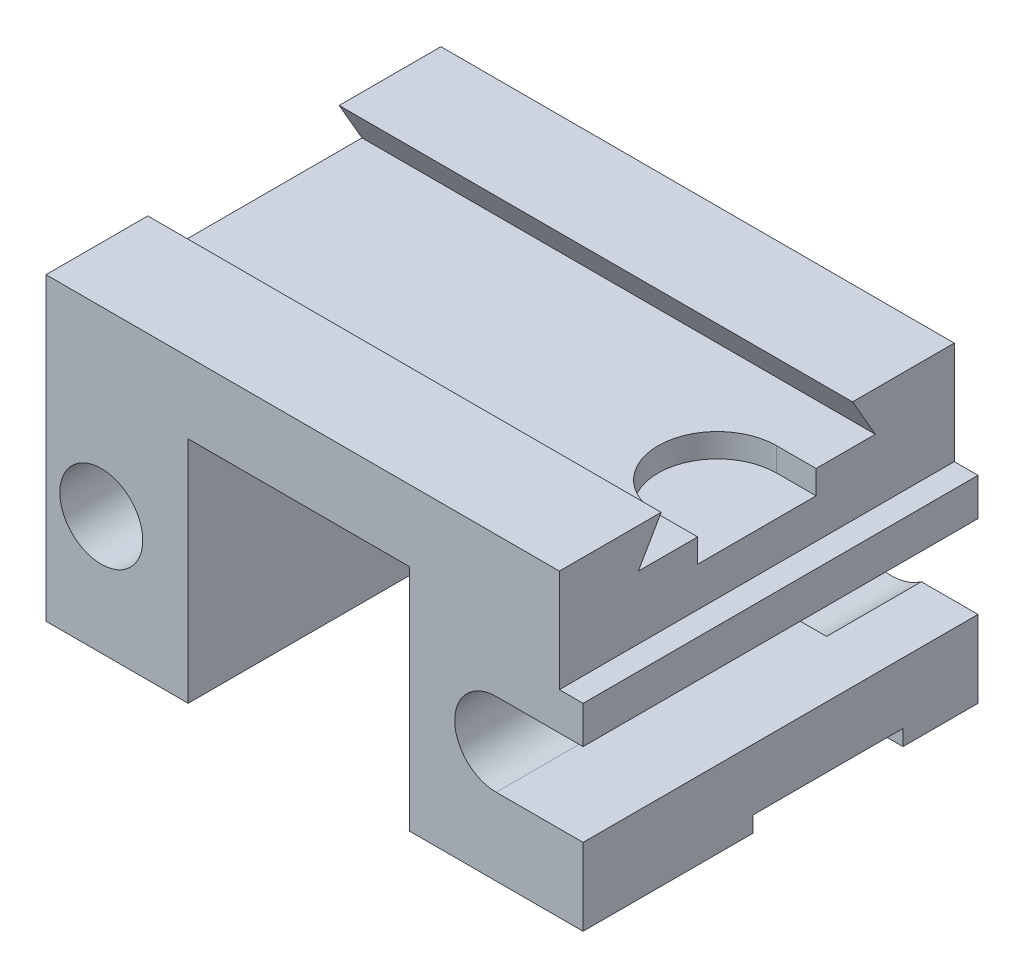
ISO-10303-21;
HEADER;
FILE_DESCRIPTION(('STEP AP214'),'2;1');
FILE_NAME('part.step','',(''),(''),'','','');
FILE_SCHEMA(('AUTOMOTIVE_DESIGN { 1 0 10303 214 1 1 1 1 }'));
ENDSEC;
DATA;
#1=APPLICATION_CONTEXT('core data for automotive mechanical design processes');
#2=APPLICATION_PROTOCOL_DEFINITION('international standard','automotive_design',2000,#1);
#3=PRODUCT_CONTEXT('',#1,'mechanical');
#4=PRODUCT('Part','Part','',(#3));
#5=PRODUCT_RELATED_PRODUCT_CATEGORY('part','',(#4));
#6=PRODUCT_DEFINITION_FORMATION('','',#4);
#7=PRODUCT_DEFINITION_CONTEXT('part definition',#1,'design');
#8=PRODUCT_DEFINITION('design','',#6,#7);
#9=PRODUCT_DEFINITION_SHAPE('','',#8);
#10=(LENGTH_UNIT() NAMED_UNIT(*) SI_UNIT(.MILLI.,.METRE.));
#11=(NAMED_UNIT(*) PLANE_ANGLE_UNIT() SI_UNIT($,.RADIAN.));
#12=(NAMED_UNIT(*) SI_UNIT($,.STERADIAN.) SOLID_ANGLE_UNIT());
#13=UNCERTAINTY_MEASURE_WITH_UNIT(LENGTH_MEASURE(1.E-05),#10,'distance_accuracy_value','');
#14=(GEOMETRIC_REPRESENTATION_CONTEXT(3) GLOBAL_UNCERTAINTY_ASSIGNED_CONTEXT((#13)) GLOBAL_UNIT_ASSIGNED_CONTEXT((#10,
#11,#12)) REPRESENTATION_CONTEXT('',''));
#15=CARTESIAN_POINT('',(0.,0.,0.));
#16=DIRECTION('',(0.,0.,1.));
#17=DIRECTION('',(1.,0.,0.));
#18=AXIS2_PLACEMENT_3D('',#15,#16,#17);
#19=CARTESIAN_POINT('',(0.,3.5,0.));
#20=DIRECTION('',(0.,-1.,0.));
#21=DIRECTION('',(0.,0.,-1.));
#22=AXIS2_PLACEMENT_3D('',#19,#20,#21);
#23=PLANE('',#22);
#24=DIRECTION('',(0.,0.,1.));
#25=VECTOR('',#24,1.);
#26=CARTESIAN_POINT('',(6.5,3.5,0.));
#27=LINE('',#26,#25);
#28=CARTESIAN_POINT('',(6.5,3.5,1.));
#29=VERTEX_POINT('',#28);
#30=CARTESIAN_POINT('',(6.5,3.5,1.75));
#31=VERTEX_POINT('',#30);
#32=EDGE_CURVE('E258',#29,#31,#27,.T.);
#33=ORIENTED_EDGE('',*,*,#32,.F.);
#34=DIRECTION('',(1.,0.,0.));
#35=VECTOR('',#34,1.);
#36=CARTESIAN_POINT('',(0.,3.5,1.));
#37=LINE('',#36,#35);
#38=CARTESIAN_POINT('',(0.,3.5,1.));
#39=VERTEX_POINT('',#38);
#40=EDGE_CURVE('E292',#39,#29,#37,.T.);
#41=ORIENTED_EDGE('',*,*,#40,.F.);
#42=DIRECTION('',(0.,0.,-1.));
#43=VECTOR('',#42,1.);
#44=CARTESIAN_POINT('',(0.,3.5,0.));
#45=LINE('',#44,#43);
#46=CARTESIAN_POINT('',(0.,3.5,4.));
#47=VERTEX_POINT('',#46);
#48=EDGE_CURVE('E282',#47,#39,#45,.T.);
#49=ORIENTED_EDGE('',*,*,#48,.F.);
#50=DIRECTION('',(1.,0.,0.));
#51=VECTOR('',#50,1.);
#52=CARTESIAN_POINT('',(0.,3.5,4.));
#53=LINE('',#52,#51);
#54=CARTESIAN_POINT('',(6.5,3.5,4.));
#55=VERTEX_POINT('',#54);
#56=EDGE_CURVE('E293',#47,#55,#53,.T.);
#57=ORIENTED_EDGE('',*,*,#56,.T.);
#58=CARTESIAN_POINT('',(6.5,3.5,3.25));
#59=VERTEX_POINT('',#58);
#60=EDGE_CURVE('E256',#59,#55,#27,.T.);
#61=ORIENTED_EDGE('',*,*,#60,.F.);
#62=DIRECTION('',(1.,0.,0.));
#63=VECTOR('',#62,1.);
#64=CARTESIAN_POINT('',(0.,3.5,3.25));
#65=LINE('',#64,#63);
#66=CARTESIAN_POINT('',(6.,3.5,3.25));
#67=VERTEX_POINT('',#66);
#68=EDGE_CURVE('E275',#67,#59,#65,.T.);
#69=ORIENTED_EDGE('',*,*,#68,.F.);
#70=CARTESIAN_POINT('',(6.,3.5,2.5));
#71=DIRECTION('',(0.,1.,0.));
#72=DIRECTION('',(0.,0.,1.));
#73=AXIS2_PLACEMENT_3D('',#70,#71,#72);
#74=CIRCLE('',#73,0.75);
#75=CARTESIAN_POINT('',(6.,3.5,1.75));
#76=VERTEX_POINT('',#75);
#77=EDGE_CURVE('E59',#76,#67,#74,.T.);
#78=ORIENTED_EDGE('',*,*,#77,.F.);
#79=DIRECTION('',(1.,0.,0.));
#80=VECTOR('',#79,1.);
#81=CARTESIAN_POINT('',(0.,3.5,1.75));
#82=LINE('',#81,#80);
#83=EDGE_CURVE('E267',#76,#31,#82,.T.);
#84=ORIENTED_EDGE('',*,*,#83,.T.);
#85=EDGE_LOOP('',(#33,#41,#49,#57,#61,#69,#78,#84));
#86=FACE_BOUND('',#85,.T.);
#87=ADVANCED_FACE('F37',(#86),#23,.F.);
#88=CARTESIAN_POINT('',(0.,4.,0.));
#89=DIRECTION('',(0.,1.,0.));
#90=DIRECTION('',(0.,0.,1.));
#91=AXIS2_PLACEMENT_3D('',#88,#89,#90);
#92=PLANE('',#91);
#93=DIRECTION('',(1.,0.,0.));
#94=VECTOR('',#93,1.);
#95=CARTESIAN_POINT('',(0.,4.,5.));
#96=LINE('',#95,#94);
#97=CARTESIAN_POINT('',(0.,4.,5.));
#98=VERTEX_POINT('',#97);
#99=CARTESIAN_POINT('',(6.5,4.,5.));
#100=VERTEX_POINT('',#99);
#101=EDGE_CURVE('E428',#98,#100,#96,.T.);
#102=ORIENTED_EDGE('',*,*,#101,.T.);
#103=DIRECTION('',(0.,0.,1.));
#104=VECTOR('',#103,1.);
#105=CARTESIAN_POINT('',(6.5,4.,5.));
#106=LINE('',#105,#104);
#107=CARTESIAN_POINT('',(6.5,4.,3.71132486540518));
#108=VERTEX_POINT('',#107);
#109=EDGE_CURVE('E235',#108,#100,#106,.T.);
#110=ORIENTED_EDGE('',*,*,#109,.F.);
#111=DIRECTION('',(1.,0.,0.));
#112=VECTOR('',#111,1.);
#113=CARTESIAN_POINT('',(0.,4.,3.71132486540518));
#114=LINE('',#113,#112);
#115=CARTESIAN_POINT('',(0.,4.,3.71132486540518));
#116=VERTEX_POINT('',#115);
#117=EDGE_CURVE('E297',#116,#108,#114,.T.);
#118=ORIENTED_EDGE('',*,*,#117,.F.);
#119=DIRECTION('',(0.,0.,1.));
#120=VECTOR('',#119,1.);
#121=CARTESIAN_POINT('',(0.,4.,0.));
#122=LINE('',#121,#120);
#123=EDGE_CURVE('E424',#116,#98,#122,.T.);
#124=ORIENTED_EDGE('',*,*,#123,.T.);
#125=EDGE_LOOP('',(#102,#110,#118,#124));
#126=FACE_BOUND('',#125,.T.);
#127=ADVANCED_FACE('F545',(#126),#92,.T.);
#128=DIRECTION('',(1.,0.,0.));
#129=VECTOR('',#128,1.);
#130=CARTESIAN_POINT('',(0.,4.,1.28867513459482));
#131=LINE('',#130,#129);
#132=CARTESIAN_POINT('',(0.,4.,1.28867513459482));
#133=VERTEX_POINT('',#132);
#134=CARTESIAN_POINT('',(6.5,4.,1.28867513459482));
#135=VERTEX_POINT('',#134);
#136=EDGE_CURVE('E300',#133,#135,#131,.T.);
#137=ORIENTED_EDGE('',*,*,#136,.T.);
#138=CARTESIAN_POINT('',(6.5,4.,0.));
#139=VERTEX_POINT('',#138);
#140=EDGE_CURVE('E247',#139,#135,#106,.T.);
#141=ORIENTED_EDGE('',*,*,#140,.F.);
#142=DIRECTION('',(-1.,0.,0.));
#143=VECTOR('',#142,1.);
#144=CARTESIAN_POINT('',(6.8,4.,0.));
#145=LINE('',#144,#143);
#146=CARTESIAN_POINT('',(0.,4.,0.));
#147=VERTEX_POINT('',#146);
#148=EDGE_CURVE('E398',#139,#147,#145,.T.);
#149=ORIENTED_EDGE('',*,*,#148,.T.);
#150=EDGE_CURVE('E425',#147,#133,#122,.T.);
#151=ORIENTED_EDGE('',*,*,#150,.T.);
#152=EDGE_LOOP('',(#137,#141,#149,#151));
#153=FACE_BOUND('',#152,.T.);
#154=ADVANCED_FACE('F518',(#153),#92,.T.);
#155=CARTESIAN_POINT('',(0.,2.6070508075689,4.51554445662276));
#156=DIRECTION('',(0.,0.500000000000004,0.866025403784436));
#157=DIRECTION('',(0.,-0.866025403784436,0.500000000000004));
#158=AXIS2_PLACEMENT_3D('',#155,#156,#157);
#159=PLANE('',#158);
#160=DIRECTION('',(0.,0.866025403784436,-0.500000000000004));
#161=VECTOR('',#160,1.);
#162=CARTESIAN_POINT('',(6.5,2.6070508075689,4.51554445662276));
#163=LINE('',#162,#161);
#164=EDGE_CURVE('E261',#55,#108,#163,.T.);
#165=ORIENTED_EDGE('',*,*,#164,.F.);
#166=ORIENTED_EDGE('',*,*,#56,.F.);
#167=DIRECTION('',(0.,-0.866025403784436,0.500000000000004));
#168=VECTOR('',#167,1.);
#169=CARTESIAN_POINT('',(0.,2.6070508075689,4.51554445662276));
#170=LINE('',#169,#168);
#171=EDGE_CURVE('E289',#116,#47,#170,.T.);
#172=ORIENTED_EDGE('',*,*,#171,.F.);
#173=ORIENTED_EDGE('',*,*,#117,.T.);
#174=EDGE_LOOP('',(#165,#166,#172,#173));
#175=FACE_BOUND('',#174,.T.);
#176=ADVANCED_FACE('F542',(#175),#159,.F.);
#177=CARTESIAN_POINT('',(0.,0.441987298107791,-0.765544456622779));
#178=DIRECTION('',(0.,0.500000000000004,-0.866025403784437));
#179=DIRECTION('',(0.,0.866025403784437,0.500000000000004));
#180=AXIS2_PLACEMENT_3D('',#177,#178,#179);
#181=PLANE('',#180);
#182=DIRECTION('',(0.,-0.866025403784437,-0.500000000000004));
#183=VECTOR('',#182,1.);
#184=CARTESIAN_POINT('',(6.5,0.441987298107791,-0.765544456622779));
#185=LINE('',#184,#183);
#186=EDGE_CURVE('E259',#135,#29,#185,.T.);
#187=ORIENTED_EDGE('',*,*,#186,.F.);
#188=ORIENTED_EDGE('',*,*,#136,.F.);
#189=DIRECTION('',(0.,0.866025403784437,0.500000000000004));
#190=VECTOR('',#189,1.);
#191=CARTESIAN_POINT('',(0.,0.441987298107791,-0.765544456622779));
#192=LINE('',#191,#190);
#193=EDGE_CURVE('E286',#39,#133,#192,.T.);
#194=ORIENTED_EDGE('',*,*,#193,.F.);
#195=ORIENTED_EDGE('',*,*,#40,.T.);
#196=EDGE_LOOP('',(#187,#188,#194,#195));
#197=FACE_BOUND('',#196,.T.);
#198=ADVANCED_FACE('F522',(#197),#181,.F.);
#199=CARTESIAN_POINT('',(0.,3.2,1.75));
#200=DIRECTION('',(0.,0.,1.));
#201=DIRECTION('',(1.,0.,0.));
#202=AXIS2_PLACEMENT_3D('',#199,#200,#201);
#203=PLANE('',#202);
#204=DIRECTION('',(1.,0.,0.));
#205=VECTOR('',#204,1.);
#206=CARTESIAN_POINT('',(0.,3.2,1.75));
#207=LINE('',#206,#205);
#208=CARTESIAN_POINT('',(6.,3.2,1.75));
#209=VERTEX_POINT('',#208);
#210=CARTESIAN_POINT('',(6.5,3.2,1.75));
#211=VERTEX_POINT('',#210);
#212=EDGE_CURVE('E270',#209,#211,#207,.T.);
#213=ORIENTED_EDGE('',*,*,#212,.T.);
#214=DIRECTION('',(0.,1.,0.));
#215=VECTOR('',#214,1.);
#216=CARTESIAN_POINT('',(6.5,3.2,1.75));
#217=LINE('',#216,#215);
#218=EDGE_CURVE('E52',#211,#31,#217,.T.);
#219=ORIENTED_EDGE('',*,*,#218,.T.);
#220=ORIENTED_EDGE('',*,*,#83,.F.);
#221=DIRECTION('',(0.,1.,0.));
#222=VECTOR('',#221,1.);
#223=CARTESIAN_POINT('',(6.,3.2,1.75));
#224=LINE('',#223,#222);
#225=EDGE_CURVE('E280',#209,#76,#224,.T.);
#226=ORIENTED_EDGE('',*,*,#225,.F.);
#227=EDGE_LOOP('',(#213,#219,#220,#226));
#228=FACE_BOUND('',#227,.T.);
#229=ADVANCED_FACE('F528',(#228),#203,.T.);
#230=CARTESIAN_POINT('',(0.,3.2,3.25));
#231=DIRECTION('',(0.,0.,1.));
#232=DIRECTION('',(0.,-1.,0.));
#233=AXIS2_PLACEMENT_3D('',#230,#231,#232);
#234=PLANE('',#233);
#235=DIRECTION('',(0.,1.,0.));
#236=VECTOR('',#235,1.);
#237=CARTESIAN_POINT('',(6.5,3.2,3.25));
#238=LINE('',#237,#236);
#239=CARTESIAN_POINT('',(6.5,3.2,3.25));
#240=VERTEX_POINT('',#239);
#241=EDGE_CURVE('E249',#240,#59,#238,.T.);
#242=ORIENTED_EDGE('',*,*,#241,.F.);
#243=DIRECTION('',(1.,0.,0.));
#244=VECTOR('',#243,1.);
#245=CARTESIAN_POINT('',(0.,3.2,3.25));
#246=LINE('',#245,#244);
#247=CARTESIAN_POINT('',(6.,3.2,3.25));
#248=VERTEX_POINT('',#247);
#249=EDGE_CURVE('E266',#248,#240,#246,.T.);
#250=ORIENTED_EDGE('',*,*,#249,.F.);
#251=DIRECTION('',(0.,1.,0.));
#252=VECTOR('',#251,1.);
#253=CARTESIAN_POINT('',(6.,3.2,3.25));
#254=LINE('',#253,#252);
#255=EDGE_CURVE('E273',#248,#67,#254,.T.);
#256=ORIENTED_EDGE('',*,*,#255,.T.);
#257=ORIENTED_EDGE('',*,*,#68,.T.);
#258=EDGE_LOOP('',(#242,#250,#256,#257));
#259=FACE_BOUND('',#258,.T.);
#260=ADVANCED_FACE('F538',(#259),#234,.F.);
#261=CARTESIAN_POINT('',(0.,3.2,0.));
#262=DIRECTION('',(0.,1.,0.));
#263=DIRECTION('',(0.,0.,1.));
#264=AXIS2_PLACEMENT_3D('',#261,#262,#263);
#265=PLANE('',#264);
#266=ORIENTED_EDGE('',*,*,#249,.T.);
#267=DIRECTION('',(0.,0.,-1.));
#268=VECTOR('',#267,1.);
#269=CARTESIAN_POINT('',(6.5,3.2,0.));
#270=LINE('',#269,#268);
#271=EDGE_CURVE('E11',#240,#211,#270,.T.);
#272=ORIENTED_EDGE('',*,*,#271,.T.);
#273=ORIENTED_EDGE('',*,*,#212,.F.);
#274=CARTESIAN_POINT('',(6.,3.2,2.5));
#275=DIRECTION('',(0.,1.,0.));
#276=DIRECTION('',(0.,0.,1.));
#277=AXIS2_PLACEMENT_3D('',#274,#275,#276);
#278=CIRCLE('',#277,0.75);
#279=EDGE_CURVE('E263',#209,#248,#278,.T.);
#280=ORIENTED_EDGE('',*,*,#279,.T.);
#281=EDGE_LOOP('',(#266,#272,#273,#280));
#282=FACE_BOUND('',#281,.T.);
#283=ADVANCED_FACE('F532',(#282),#265,.T.);
#284=CARTESIAN_POINT('',(6.8,0.2,5.));
#285=DIRECTION('',(1.,0.,0.));
#286=DIRECTION('',(0.,0.,-1.));
#287=AXIS2_PLACEMENT_3D('',#284,#285,#286);
#288=PLANE('',#287);
#289=DIRECTION('',(0.,0.,-1.));
#290=VECTOR('',#289,1.);
#291=CARTESIAN_POINT('',(6.8,2.7,5.));
#292=LINE('',#291,#290);
#293=CARTESIAN_POINT('',(6.8,2.7,5.));
#294=VERTEX_POINT('',#293);
#295=CARTESIAN_POINT('',(6.8,2.7,0.));
#296=VERTEX_POINT('',#295);
#297=EDGE_CURVE('E239',#294,#296,#292,.T.);
#298=ORIENTED_EDGE('',*,*,#297,.F.);
#299=DIRECTION('',(0.,1.,0.));
#300=VECTOR('',#299,1.);
#301=CARTESIAN_POINT('',(6.8,0.2,5.));
#302=LINE('',#301,#300);
#303=CARTESIAN_POINT('',(6.8,2.225,5.));
#304=VERTEX_POINT('',#303);
#305=EDGE_CURVE('E246',#304,#294,#302,.T.);
#306=ORIENTED_EDGE('',*,*,#305,.F.);
#307=DIRECTION('',(0.,0.,1.));
#308=VECTOR('',#307,1.);
#309=CARTESIAN_POINT('',(6.8,2.225,0.));
#310=LINE('',#309,#308);
#311=CARTESIAN_POINT('',(6.8,2.225,0.));
#312=VERTEX_POINT('',#311);
#313=EDGE_CURVE('E314',#312,#304,#310,.T.);
#314=ORIENTED_EDGE('',*,*,#313,.F.);
#315=DIRECTION('',(0.,1.,0.));
#316=VECTOR('',#315,1.);
#317=CARTESIAN_POINT('',(6.8,0.2,0.));
#318=LINE('',#317,#316);
#319=EDGE_CURVE('E434',#312,#296,#318,.T.);
#320=ORIENTED_EDGE('',*,*,#319,.T.);
#321=EDGE_LOOP('',(#298,#306,#314,#320));
#322=FACE_BOUND('',#321,.T.);
#323=ADVANCED_FACE('F548',(#322),#288,.T.);
#324=CARTESIAN_POINT('',(6.8,0.2,0.));
#325=DIRECTION('',(0.,0.,-1.));
#326=DIRECTION('',(-1.,0.,0.));
#327=AXIS2_PLACEMENT_3D('',#324,#325,#326);
#328=PLANE('',#327);
#329=DIRECTION('',(1.,0.,0.));
#330=VECTOR('',#329,1.);
#331=CARTESIAN_POINT('',(6.5,2.7,0.));
#332=LINE('',#331,#330);
#333=CARTESIAN_POINT('',(6.5,2.7,0.));
#334=VERTEX_POINT('',#333);
#335=EDGE_CURVE('E227',#334,#296,#332,.T.);
#336=ORIENTED_EDGE('',*,*,#335,.T.);
#337=ORIENTED_EDGE('',*,*,#319,.F.);
#338=DIRECTION('',(1.,0.,0.));
#339=VECTOR('',#338,1.);
#340=CARTESIAN_POINT('',(0.,2.225,0.));
#341=LINE('',#340,#339);
#342=CARTESIAN_POINT('',(6.08324274291892,2.225,0.));
#343=VERTEX_POINT('',#342);
#344=EDGE_CURVE('E305',#343,#312,#341,.T.);
#345=ORIENTED_EDGE('',*,*,#344,.F.);
#346=CARTESIAN_POINT('',(5.7,1.7,0.));
#347=DIRECTION('',(0.,0.,-1.));
#348=DIRECTION('',(-1.,0.,0.));
#349=AXIS2_PLACEMENT_3D('',#346,#347,#348);
#350=CIRCLE('',#349,0.650000000000015);
#351=CARTESIAN_POINT('',(6.08324274291892,1.175,0.));
#352=VERTEX_POINT('',#351);
#353=EDGE_CURVE('E328',#352,#343,#350,.T.);
#354=ORIENTED_EDGE('',*,*,#353,.F.);
#355=DIRECTION('',(1.,0.,0.));
#356=VECTOR('',#355,1.);
#357=CARTESIAN_POINT('',(0.,1.175,0.));
#358=LINE('',#357,#356);
#359=CARTESIAN_POINT('',(6.8,1.175,0.));
#360=VERTEX_POINT('',#359);
#361=EDGE_CURVE('E307',#352,#360,#358,.T.);
#362=ORIENTED_EDGE('',*,*,#361,.T.);
#363=CARTESIAN_POINT('',(6.8,0.2,0.));
#364=VERTEX_POINT('',#363);
#365=EDGE_CURVE('E430',#364,#360,#318,.T.);
#366=ORIENTED_EDGE('',*,*,#365,.F.);
#367=DIRECTION('',(-1.,0.,0.));
#368=VECTOR('',#367,1.);
#369=CARTESIAN_POINT('',(6.8,0.2,0.));
#370=LINE('',#369,#368);
#371=CARTESIAN_POINT('',(4.6,0.2,0.));
#372=VERTEX_POINT('',#371);
#373=EDGE_CURVE('E407',#364,#372,#370,.T.);
#374=ORIENTED_EDGE('',*,*,#373,.T.);
#375=DIRECTION('',(0.,1.,0.));
#376=VECTOR('',#375,1.);
#377=CARTESIAN_POINT('',(4.6,0.2,0.));
#378=LINE('',#377,#376);
#379=CARTESIAN_POINT('',(4.6,3.1,0.));
#380=VERTEX_POINT('',#379);
#381=EDGE_CURVE('E382',#372,#380,#378,.T.);
#382=ORIENTED_EDGE('',*,*,#381,.T.);
#383=DIRECTION('',(-1.,0.,0.));
#384=VECTOR('',#383,1.);
#385=CARTESIAN_POINT('',(4.6,3.1,0.));
#386=LINE('',#385,#384);
#387=CARTESIAN_POINT('',(1.8,3.1,0.));
#388=VERTEX_POINT('',#387);
#389=EDGE_CURVE('E386',#380,#388,#386,.T.);
#390=ORIENTED_EDGE('',*,*,#389,.T.);
#391=DIRECTION('',(0.,-1.,0.));
#392=VECTOR('',#391,1.);
#393=CARTESIAN_POINT('',(1.8,3.1,0.));
#394=LINE('',#393,#392);
#395=CARTESIAN_POINT('',(1.8,0.2,0.));
#396=VERTEX_POINT('',#395);
#397=EDGE_CURVE('E379',#388,#396,#394,.T.);
#398=ORIENTED_EDGE('',*,*,#397,.T.);
#399=CARTESIAN_POINT('',(0.,0.2,0.));
#400=VERTEX_POINT('',#399);
#401=EDGE_CURVE('E411',#396,#400,#370,.T.);
#402=ORIENTED_EDGE('',*,*,#401,.T.);
#403=DIRECTION('',(0.,1.,0.));
#404=VECTOR('',#403,1.);
#405=CARTESIAN_POINT('',(0.,0.2,0.));
#406=LINE('',#405,#404);
#407=EDGE_CURVE('E422',#400,#147,#406,.T.);
#408=ORIENTED_EDGE('',*,*,#407,.T.);
#409=ORIENTED_EDGE('',*,*,#148,.F.);
#410=DIRECTION('',(0.,1.,0.));
#411=VECTOR('',#410,1.);
#412=CARTESIAN_POINT('',(6.5,4.,0.));
#413=LINE('',#412,#411);
#414=EDGE_CURVE('E229',#334,#139,#413,.T.);
#415=ORIENTED_EDGE('',*,*,#414,.F.);
#416=EDGE_LOOP('',(#336,#337,#345,#354,#362,#366,#374,#382,#390,#398,#402,#408,#409,#415));
#417=FACE_BOUND('',#416,.T.);
#418=CARTESIAN_POINT('',(0.700000000000001,1.7,0.));
#419=DIRECTION('',(0.,0.,-1.));
#420=DIRECTION('',(-1.,0.,0.));
#421=AXIS2_PLACEMENT_3D('',#418,#419,#420);
#422=CIRCLE('',#421,0.650000000000015);
#423=CARTESIAN_POINT('',(0.0499999999999854,1.7,0.));
#424=VERTEX_POINT('',#423);
#425=EDGE_CURVE('E340',#424,#424,#422,.T.);
#426=ORIENTED_EDGE('',*,*,#425,.F.);
#427=EDGE_LOOP('',(#426));
#428=FACE_BOUND('',#427,.T.);
#429=ADVANCED_FACE('F39',(#417,#428),#328,.T.);
#430=CARTESIAN_POINT('',(0.,0.2,5.));
#431=DIRECTION('',(0.,0.,1.));
#432=DIRECTION('',(1.,0.,0.));
#433=AXIS2_PLACEMENT_3D('',#430,#431,#432);
#434=PLANE('',#433);
#435=DIRECTION('',(1.,0.,0.));
#436=VECTOR('',#435,1.);
#437=CARTESIAN_POINT('',(6.5,2.7,5.));
#438=LINE('',#437,#436);
#439=CARTESIAN_POINT('',(6.5,2.7,5.));
#440=VERTEX_POINT('',#439);
#441=EDGE_CURVE('E224',#440,#294,#438,.T.);
#442=ORIENTED_EDGE('',*,*,#441,.F.);
#443=DIRECTION('',(0.,-1.,0.));
#444=VECTOR('',#443,1.);
#445=CARTESIAN_POINT('',(6.5,4.,5.));
#446=LINE('',#445,#444);
#447=EDGE_CURVE('E230',#100,#440,#446,.T.);
#448=ORIENTED_EDGE('',*,*,#447,.F.);
#449=ORIENTED_EDGE('',*,*,#101,.F.);
#450=DIRECTION('',(0.,1.,0.));
#451=VECTOR('',#450,1.);
#452=CARTESIAN_POINT('',(0.,0.2,5.));
#453=LINE('',#452,#451);
#454=CARTESIAN_POINT('',(0.,0.2,5.));
#455=VERTEX_POINT('',#454);
#456=EDGE_CURVE('E438',#455,#98,#453,.T.);
#457=ORIENTED_EDGE('',*,*,#456,.F.);
#458=DIRECTION('',(1.,0.,0.));
#459=VECTOR('',#458,1.);
#460=CARTESIAN_POINT('',(0.,0.2,5.));
#461=LINE('',#460,#459);
#462=CARTESIAN_POINT('',(1.8,0.2,5.));
#463=VERTEX_POINT('',#462);
#464=EDGE_CURVE('E415',#455,#463,#461,.T.);
#465=ORIENTED_EDGE('',*,*,#464,.T.);
#466=DIRECTION('',(0.,-1.,0.));
#467=VECTOR('',#466,1.);
#468=CARTESIAN_POINT('',(1.8,3.1,5.));
#469=LINE('',#468,#467);
#470=CARTESIAN_POINT('',(1.8,3.1,5.));
#471=VERTEX_POINT('',#470);
#472=EDGE_CURVE('E372',#471,#463,#469,.T.);
#473=ORIENTED_EDGE('',*,*,#472,.F.);
#474=DIRECTION('',(-1.,0.,0.));
#475=VECTOR('',#474,1.);
#476=CARTESIAN_POINT('',(4.6,3.1,5.));
#477=LINE('',#476,#475);
#478=CARTESIAN_POINT('',(4.6,3.1,5.));
#479=VERTEX_POINT('',#478);
#480=EDGE_CURVE('E383',#479,#471,#477,.T.);
#481=ORIENTED_EDGE('',*,*,#480,.F.);
#482=DIRECTION('',(0.,1.,0.));
#483=VECTOR('',#482,1.);
#484=CARTESIAN_POINT('',(4.6,0.2,5.));
#485=LINE('',#484,#483);
#486=CARTESIAN_POINT('',(4.6,0.2,5.));
#487=VERTEX_POINT('',#486);
#488=EDGE_CURVE('E391',#487,#479,#485,.T.);
#489=ORIENTED_EDGE('',*,*,#488,.F.);
#490=CARTESIAN_POINT('',(6.8,0.2,5.));
#491=VERTEX_POINT('',#490);
#492=EDGE_CURVE('E414',#487,#491,#461,.T.);
#493=ORIENTED_EDGE('',*,*,#492,.T.);
#494=CARTESIAN_POINT('',(6.8,1.175,5.));
#495=VERTEX_POINT('',#494);
#496=EDGE_CURVE('E435',#491,#495,#302,.T.);
#497=ORIENTED_EDGE('',*,*,#496,.T.);
#498=DIRECTION('',(1.,0.,0.));
#499=VECTOR('',#498,1.);
#500=CARTESIAN_POINT('',(0.,1.175,5.));
#501=LINE('',#500,#499);
#502=CARTESIAN_POINT('',(5.7,1.17499999999999,5.));
#503=VERTEX_POINT('',#502);
#504=EDGE_CURVE('E308',#503,#495,#501,.T.);
#505=ORIENTED_EDGE('',*,*,#504,.F.);
#506=CARTESIAN_POINT('',(5.7,1.7,5.));
#507=DIRECTION('',(0.,0.,-1.));
#508=DIRECTION('',(-1.,0.,0.));
#509=AXIS2_PLACEMENT_3D('',#506,#507,#508);
#510=CIRCLE('',#509,0.525000000000013);
#511=CARTESIAN_POINT('',(5.7,2.225,5.));
#512=VERTEX_POINT('',#511);
#513=EDGE_CURVE('E337',#503,#512,#510,.T.);
#514=ORIENTED_EDGE('',*,*,#513,.T.);
#515=DIRECTION('',(1.,0.,0.));
#516=VECTOR('',#515,1.);
#517=CARTESIAN_POINT('',(0.,2.225,5.));
#518=LINE('',#517,#516);
#519=EDGE_CURVE('E296',#512,#304,#518,.T.);
#520=ORIENTED_EDGE('',*,*,#519,.T.);
#521=ORIENTED_EDGE('',*,*,#305,.T.);
#522=EDGE_LOOP('',(#442,#448,#449,#457,#465,#473,#481,#489,#493,#497,#505,#514,#520,#521));
#523=FACE_BOUND('',#522,.T.);
#524=CARTESIAN_POINT('',(0.700000000000001,1.7,5.));
#525=DIRECTION('',(0.,0.,-1.));
#526=DIRECTION('',(-1.,0.,0.));
#527=AXIS2_PLACEMENT_3D('',#524,#525,#526);
#528=CIRCLE('',#527,0.525000000000013);
#529=CARTESIAN_POINT('',(0.174999999999988,1.7,5.));
#530=VERTEX_POINT('',#529);
#531=EDGE_CURVE('E349',#530,#530,#528,.T.);
#532=ORIENTED_EDGE('',*,*,#531,.T.);
#533=EDGE_LOOP('',(#532));
#534=FACE_BOUND('',#533,.T.);
#535=ADVANCED_FACE('F242',(#523,#534),#434,.T.);
#536=CARTESIAN_POINT('',(6.22500000000001,1.7,1.2));
#537=DIRECTION('',(0.,0.,1.));
#538=DIRECTION('',(1.,0.,0.));
#539=AXIS2_PLACEMENT_3D('',#536,#537,#538);
#540=PLANE('',#539);
#541=DIRECTION('',(1.,0.,0.));
#542=VECTOR('',#541,1.);
#543=CARTESIAN_POINT('',(6.22500000000001,2.225,1.2));
#544=LINE('',#543,#542);
#545=CARTESIAN_POINT('',(5.7,2.225,1.2));
#546=VERTEX_POINT('',#545);
#547=CARTESIAN_POINT('',(6.08324274291892,2.225,1.2));
#548=VERTEX_POINT('',#547);
#549=EDGE_CURVE('E326',#546,#548,#544,.T.);
#550=ORIENTED_EDGE('',*,*,#549,.F.);
#551=CARTESIAN_POINT('',(5.7,1.7,1.2));
#552=DIRECTION('',(0.,0.,-1.));
#553=DIRECTION('',(-1.,0.,0.));
#554=AXIS2_PLACEMENT_3D('',#551,#552,#553);
#555=CIRCLE('',#554,0.525000000000013);
#556=CARTESIAN_POINT('',(5.7,1.17499999999999,1.2));
#557=VERTEX_POINT('',#556);
#558=EDGE_CURVE('E334',#557,#546,#555,.T.);
#559=ORIENTED_EDGE('',*,*,#558,.F.);
#560=DIRECTION('',(1.,0.,0.));
#561=VECTOR('',#560,1.);
#562=CARTESIAN_POINT('',(6.22500000000001,1.175,1.2));
#563=LINE('',#562,#561);
#564=CARTESIAN_POINT('',(6.08324274291892,1.175,1.2));
#565=VERTEX_POINT('',#564);
#566=EDGE_CURVE('E316',#557,#565,#563,.T.);
#567=ORIENTED_EDGE('',*,*,#566,.T.);
#568=CARTESIAN_POINT('',(5.7,1.7,1.2));
#569=DIRECTION('',(0.,0.,-1.));
#570=DIRECTION('',(-1.,0.,0.));
#571=AXIS2_PLACEMENT_3D('',#568,#569,#570);
#572=CIRCLE('',#571,0.650000000000015);
#573=EDGE_CURVE('E331',#565,#548,#572,.T.);
#574=ORIENTED_EDGE('',*,*,#573,.T.);
#575=EDGE_LOOP('',(#550,#559,#567,#574));
#576=FACE_BOUND('',#575,.T.);
#577=ADVANCED_FACE('F463',(#576),#540,.F.);
#578=CARTESIAN_POINT('',(5.7,1.7,0.));
#579=DIRECTION('',(0.,0.,-1.));
#580=DIRECTION('',(-1.,0.,0.));
#581=AXIS2_PLACEMENT_3D('',#578,#579,#580);
#582=CYLINDRICAL_SURFACE('',#581,0.650000000000015);
#583=DIRECTION('',(0.,0.,-1.));
#584=VECTOR('',#583,1.);
#585=CARTESIAN_POINT('',(6.08324274291892,2.225,0.));
#586=LINE('',#585,#584);
#587=EDGE_CURVE('E45',#548,#343,#586,.T.);
#588=ORIENTED_EDGE('',*,*,#587,.F.);
#589=ORIENTED_EDGE('',*,*,#573,.F.);
#590=DIRECTION('',(0.,0.,-1.));
#591=VECTOR('',#590,1.);
#592=CARTESIAN_POINT('',(6.08324274291892,1.175,0.));
#593=LINE('',#592,#591);
#594=EDGE_CURVE('E433',#565,#352,#593,.T.);
#595=ORIENTED_EDGE('',*,*,#594,.T.);
#596=ORIENTED_EDGE('',*,*,#353,.T.);
#597=EDGE_LOOP('',(#588,#589,#595,#596));
#598=FACE_BOUND('',#597,.T.);
#599=ADVANCED_FACE('F457',(#598),#582,.F.);
#600=CARTESIAN_POINT('',(0.,0.2,0.));
#601=DIRECTION('',(0.,1.,0.));
#602=DIRECTION('',(0.,0.,1.));
#603=AXIS2_PLACEMENT_3D('',#600,#601,#602);
#604=PLANE('',#603);
#605=DIRECTION('',(0.,0.,1.));
#606=VECTOR('',#605,1.);
#607=CARTESIAN_POINT('',(4.6,0.2,0.));
#608=LINE('',#607,#606);
#609=CARTESIAN_POINT('',(4.6,0.2,2.85));
#610=VERTEX_POINT('',#609);
#611=EDGE_CURVE('E404',#610,#487,#608,.T.);
#612=ORIENTED_EDGE('',*,*,#611,.F.);
#613=DIRECTION('',(1.,0.,0.));
#614=VECTOR('',#613,1.);
#615=CARTESIAN_POINT('',(4.6,0.2,2.85));
#616=LINE('',#615,#614);
#617=CARTESIAN_POINT('',(6.8,0.2,2.85));
#618=VERTEX_POINT('',#617);
#619=EDGE_CURVE('E363',#610,#618,#616,.T.);
#620=ORIENTED_EDGE('',*,*,#619,.T.);
#621=DIRECTION('',(0.,0.,-1.));
#622=VECTOR('',#621,1.);
#623=CARTESIAN_POINT('',(6.8,0.2,5.));
#624=LINE('',#623,#622);
#625=EDGE_CURVE('E419',#491,#618,#624,.T.);
#626=ORIENTED_EDGE('',*,*,#625,.F.);
#627=ORIENTED_EDGE('',*,*,#492,.F.);
#628=EDGE_LOOP('',(#612,#620,#626,#627));
#629=FACE_BOUND('',#628,.T.);
#630=ADVANCED_FACE('F477',(#629),#604,.F.);
#631=ORIENTED_EDGE('',*,*,#401,.F.);
#632=DIRECTION('',(0.,0.,1.));
#633=VECTOR('',#632,1.);
#634=CARTESIAN_POINT('',(1.8,0.2,0.));
#635=LINE('',#634,#633);
#636=EDGE_CURVE('E389',#396,#463,#635,.T.);
#637=ORIENTED_EDGE('',*,*,#636,.T.);
#638=ORIENTED_EDGE('',*,*,#464,.F.);
#639=DIRECTION('',(0.,0.,1.));
#640=VECTOR('',#639,1.);
#641=CARTESIAN_POINT('',(0.,0.2,0.));
#642=LINE('',#641,#640);
#643=EDGE_CURVE('E410',#400,#455,#642,.T.);
#644=ORIENTED_EDGE('',*,*,#643,.F.);
#645=EDGE_LOOP('',(#631,#637,#638,#644));
#646=FACE_BOUND('',#645,.T.);
#647=ADVANCED_FACE('F509',(#646),#604,.F.);
#648=DIRECTION('',(0.,0.,1.));
#649=VECTOR('',#648,1.);
#650=CARTESIAN_POINT('',(6.8,1.175,0.));
#651=LINE('',#650,#649);
#652=EDGE_CURVE('E317',#360,#495,#651,.T.);
#653=ORIENTED_EDGE('',*,*,#652,.T.);
#654=ORIENTED_EDGE('',*,*,#496,.F.);
#655=ORIENTED_EDGE('',*,*,#625,.T.);
#656=DIRECTION('',(0.,-1.,0.));
#657=VECTOR('',#656,1.);
#658=CARTESIAN_POINT('',(6.8,0.4,2.85));
#659=LINE('',#658,#657);
#660=CARTESIAN_POINT('',(6.8,0.4,2.85));
#661=VERTEX_POINT('',#660);
#662=EDGE_CURVE('E352',#661,#618,#659,.T.);
#663=ORIENTED_EDGE('',*,*,#662,.F.);
#664=DIRECTION('',(0.,0.,1.));
#665=VECTOR('',#664,1.);
#666=CARTESIAN_POINT('',(6.8,0.4,0.95));
#667=LINE('',#666,#665);
#668=CARTESIAN_POINT('',(6.8,0.4,0.95));
#669=VERTEX_POINT('',#668);
#670=EDGE_CURVE('E357',#669,#661,#667,.T.);
#671=ORIENTED_EDGE('',*,*,#670,.F.);
#672=DIRECTION('',(0.,1.,0.));
#673=VECTOR('',#672,1.);
#674=CARTESIAN_POINT('',(6.8,0.2,0.95));
#675=LINE('',#674,#673);
#676=CARTESIAN_POINT('',(6.8,0.2,0.95));
#677=VERTEX_POINT('',#676);
#678=EDGE_CURVE('E365',#677,#669,#675,.T.);
#679=ORIENTED_EDGE('',*,*,#678,.F.);
#680=EDGE_CURVE('E418',#677,#364,#624,.T.);
#681=ORIENTED_EDGE('',*,*,#680,.T.);
#682=ORIENTED_EDGE('',*,*,#365,.T.);
#683=EDGE_LOOP('',(#653,#654,#655,#663,#671,#679,#681,#682));
#684=FACE_BOUND('',#683,.T.);
#685=ADVANCED_FACE('F473',(#684),#288,.T.);
#686=CARTESIAN_POINT('',(0.,0.2,0.));
#687=DIRECTION('',(-1.,0.,0.));
#688=DIRECTION('',(0.,0.,1.));
#689=AXIS2_PLACEMENT_3D('',#686,#687,#688);
#690=PLANE('',#689);
#691=ORIENTED_EDGE('',*,*,#171,.T.);
#692=ORIENTED_EDGE('',*,*,#48,.T.);
#693=ORIENTED_EDGE('',*,*,#193,.T.);
#694=ORIENTED_EDGE('',*,*,#150,.F.);
#695=ORIENTED_EDGE('',*,*,#407,.F.);
#696=ORIENTED_EDGE('',*,*,#643,.T.);
#697=ORIENTED_EDGE('',*,*,#456,.T.);
#698=ORIENTED_EDGE('',*,*,#123,.F.);
#699=EDGE_LOOP('',(#691,#692,#693,#694,#695,#696,#697,#698));
#700=FACE_BOUND('',#699,.T.);
#701=ADVANCED_FACE('F512',(#700),#690,.T.);
#702=ORIENTED_EDGE('',*,*,#680,.F.);
#703=DIRECTION('',(1.,0.,0.));
#704=VECTOR('',#703,1.);
#705=CARTESIAN_POINT('',(4.6,0.2,0.95));
#706=LINE('',#705,#704);
#707=CARTESIAN_POINT('',(4.6,0.2,0.95));
#708=VERTEX_POINT('',#707);
#709=EDGE_CURVE('E375',#708,#677,#706,.T.);
#710=ORIENTED_EDGE('',*,*,#709,.F.);
#711=EDGE_CURVE('E401',#372,#708,#608,.T.);
#712=ORIENTED_EDGE('',*,*,#711,.F.);
#713=ORIENTED_EDGE('',*,*,#373,.F.);
#714=EDGE_LOOP('',(#702,#710,#712,#713));
#715=FACE_BOUND('',#714,.T.);
#716=ADVANCED_FACE('F495',(#715),#604,.F.);
#717=CARTESIAN_POINT('',(1.8,3.1,0.));
#718=DIRECTION('',(-1.,0.,0.));
#719=DIRECTION('',(0.,-1.,0.));
#720=AXIS2_PLACEMENT_3D('',#717,#718,#719);
#721=PLANE('',#720);
#722=ORIENTED_EDGE('',*,*,#472,.T.);
#723=ORIENTED_EDGE('',*,*,#636,.F.);
#724=ORIENTED_EDGE('',*,*,#397,.F.);
#725=DIRECTION('',(0.,0.,1.));
#726=VECTOR('',#725,1.);
#727=CARTESIAN_POINT('',(1.8,3.1,0.));
#728=LINE('',#727,#726);
#729=EDGE_CURVE('E396',#388,#471,#728,.T.);
#730=ORIENTED_EDGE('',*,*,#729,.T.);
#731=EDGE_LOOP('',(#722,#723,#724,#730));
#732=FACE_BOUND('',#731,.T.);
#733=ADVANCED_FACE('F504',(#732),#721,.F.);
#734=CARTESIAN_POINT('',(4.6,3.1,0.));
#735=DIRECTION('',(0.,1.,0.));
#736=DIRECTION('',(-1.,0.,0.));
#737=AXIS2_PLACEMENT_3D('',#734,#735,#736);
#738=PLANE('',#737);
#739=ORIENTED_EDGE('',*,*,#480,.T.);
#740=ORIENTED_EDGE('',*,*,#729,.F.);
#741=ORIENTED_EDGE('',*,*,#389,.F.);
#742=DIRECTION('',(0.,0.,1.));
#743=VECTOR('',#742,1.);
#744=CARTESIAN_POINT('',(4.6,3.1,0.));
#745=LINE('',#744,#743);
#746=EDGE_CURVE('E399',#380,#479,#745,.T.);
#747=ORIENTED_EDGE('',*,*,#746,.T.);
#748=EDGE_LOOP('',(#739,#740,#741,#747));
#749=FACE_BOUND('',#748,.T.);
#750=ADVANCED_FACE('F500',(#749),#738,.F.);
#751=CARTESIAN_POINT('',(4.6,0.2,0.));
#752=DIRECTION('',(1.,0.,0.));
#753=DIRECTION('',(0.,1.,0.));
#754=AXIS2_PLACEMENT_3D('',#751,#752,#753);
#755=PLANE('',#754);
#756=DIRECTION('',(0.,0.,1.));
#757=VECTOR('',#756,1.);
#758=CARTESIAN_POINT('',(4.6,0.4,0.95));
#759=LINE('',#758,#757);
#760=CARTESIAN_POINT('',(4.6,0.4,0.95));
#761=VERTEX_POINT('',#760);
#762=CARTESIAN_POINT('',(4.6,0.4,2.85));
#763=VERTEX_POINT('',#762);
#764=EDGE_CURVE('E360',#761,#763,#759,.T.);
#765=ORIENTED_EDGE('',*,*,#764,.T.);
#766=DIRECTION('',(0.,-1.,0.));
#767=VECTOR('',#766,1.);
#768=CARTESIAN_POINT('',(4.6,0.4,2.85));
#769=LINE('',#768,#767);
#770=EDGE_CURVE('E353',#763,#610,#769,.T.);
#771=ORIENTED_EDGE('',*,*,#770,.T.);
#772=ORIENTED_EDGE('',*,*,#611,.T.);
#773=ORIENTED_EDGE('',*,*,#488,.T.);
#774=ORIENTED_EDGE('',*,*,#746,.F.);
#775=ORIENTED_EDGE('',*,*,#381,.F.);
#776=ORIENTED_EDGE('',*,*,#711,.T.);
#777=DIRECTION('',(0.,1.,0.));
#778=VECTOR('',#777,1.);
#779=CARTESIAN_POINT('',(4.6,0.2,0.95));
#780=LINE('',#779,#778);
#781=EDGE_CURVE('E356',#708,#761,#780,.T.);
#782=ORIENTED_EDGE('',*,*,#781,.T.);
#783=EDGE_LOOP('',(#765,#771,#772,#773,#774,#775,#776,#782));
#784=FACE_BOUND('',#783,.T.);
#785=ADVANCED_FACE('F482',(#784),#755,.F.);
#786=CARTESIAN_POINT('',(4.6,0.4,2.85));
#787=DIRECTION('',(0.,0.,1.));
#788=DIRECTION('',(1.,0.,0.));
#789=AXIS2_PLACEMENT_3D('',#786,#787,#788);
#790=PLANE('',#789);
#791=ORIENTED_EDGE('',*,*,#662,.T.);
#792=ORIENTED_EDGE('',*,*,#619,.F.);
#793=ORIENTED_EDGE('',*,*,#770,.F.);
#794=DIRECTION('',(1.,0.,0.));
#795=VECTOR('',#794,1.);
#796=CARTESIAN_POINT('',(4.6,0.4,2.85));
#797=LINE('',#796,#795);
#798=EDGE_CURVE('E370',#763,#661,#797,.T.);
#799=ORIENTED_EDGE('',*,*,#798,.T.);
#800=EDGE_LOOP('',(#791,#792,#793,#799));
#801=FACE_BOUND('',#800,.T.);
#802=ADVANCED_FACE('F480',(#801),#790,.F.);
#803=CARTESIAN_POINT('',(4.6,0.4,0.95));
#804=DIRECTION('',(0.,1.,0.));
#805=DIRECTION('',(0.,0.,1.));
#806=AXIS2_PLACEMENT_3D('',#803,#804,#805);
#807=PLANE('',#806);
#808=ORIENTED_EDGE('',*,*,#670,.T.);
#809=ORIENTED_EDGE('',*,*,#798,.F.);
#810=ORIENTED_EDGE('',*,*,#764,.F.);
#811=DIRECTION('',(1.,0.,0.));
#812=VECTOR('',#811,1.);
#813=CARTESIAN_POINT('',(4.6,0.4,0.95));
#814=LINE('',#813,#812);
#815=EDGE_CURVE('E373',#761,#669,#814,.T.);
#816=ORIENTED_EDGE('',*,*,#815,.T.);
#817=EDGE_LOOP('',(#808,#809,#810,#816));
#818=FACE_BOUND('',#817,.T.);
#819=ADVANCED_FACE('F485',(#818),#807,.F.);
#820=CARTESIAN_POINT('',(4.6,0.2,0.95));
#821=DIRECTION('',(0.,0.,-1.));
#822=DIRECTION('',(-1.,0.,0.));
#823=AXIS2_PLACEMENT_3D('',#820,#821,#822);
#824=PLANE('',#823);
#825=ORIENTED_EDGE('',*,*,#678,.T.);
#826=ORIENTED_EDGE('',*,*,#815,.F.);
#827=ORIENTED_EDGE('',*,*,#781,.F.);
#828=ORIENTED_EDGE('',*,*,#709,.T.);
#829=EDGE_LOOP('',(#825,#826,#827,#828));
#830=FACE_BOUND('',#829,.T.);
#831=ADVANCED_FACE('F487',(#830),#824,.F.);
#832=CARTESIAN_POINT('',(0.700000000000001,1.7,0.));
#833=DIRECTION('',(0.,0.,-1.));
#834=DIRECTION('',(-1.,0.,0.));
#835=AXIS2_PLACEMENT_3D('',#832,#833,#834);
#836=CYLINDRICAL_SURFACE('',#835,0.525000000000013);
#837=ORIENTED_EDGE('',*,*,#531,.F.);
#838=EDGE_LOOP('',(#837));
#839=FACE_BOUND('',#838,.T.);
#840=CARTESIAN_POINT('',(0.700000000000001,1.7,1.2));
#841=DIRECTION('',(0.,0.,-1.));
#842=DIRECTION('',(-1.,0.,0.));
#843=AXIS2_PLACEMENT_3D('',#840,#841,#842);
#844=CIRCLE('',#843,0.525000000000013);
#845=CARTESIAN_POINT('',(0.174999999999987,1.7,1.2));
#846=VERTEX_POINT('',#845);
#847=EDGE_CURVE('E346',#846,#846,#844,.T.);
#848=ORIENTED_EDGE('',*,*,#847,.T.);
#849=EDGE_LOOP('',(#848));
#850=FACE_BOUND('',#849,.T.);
#851=ADVANCED_FACE('F584',(#839,#850),#836,.F.);
#852=CARTESIAN_POINT('',(1.22500000000001,1.7,1.2));
#853=DIRECTION('',(0.,0.,1.));
#854=DIRECTION('',(1.,0.,0.));
#855=AXIS2_PLACEMENT_3D('',#852,#853,#854);
#856=PLANE('',#855);
#857=ORIENTED_EDGE('',*,*,#847,.F.);
#858=EDGE_LOOP('',(#857));
#859=FACE_BOUND('',#858,.T.);
#860=CARTESIAN_POINT('',(0.700000000000001,1.7,1.2));
#861=DIRECTION('',(0.,0.,-1.));
#862=DIRECTION('',(-1.,0.,0.));
#863=AXIS2_PLACEMENT_3D('',#860,#861,#862);
#864=CIRCLE('',#863,0.650000000000015);
#865=CARTESIAN_POINT('',(0.0499999999999854,1.7,1.2));
#866=VERTEX_POINT('',#865);
#867=EDGE_CURVE('E343',#866,#866,#864,.T.);
#868=ORIENTED_EDGE('',*,*,#867,.T.);
#869=EDGE_LOOP('',(#868));
#870=FACE_BOUND('',#869,.T.);
#871=ADVANCED_FACE('F580',(#859,#870),#856,.F.);
#872=CARTESIAN_POINT('',(0.700000000000001,1.7,0.));
#873=DIRECTION('',(0.,0.,-1.));
#874=DIRECTION('',(-1.,0.,0.));
#875=AXIS2_PLACEMENT_3D('',#872,#873,#874);
#876=CYLINDRICAL_SURFACE('',#875,0.650000000000015);
#877=ORIENTED_EDGE('',*,*,#867,.F.);
#878=EDGE_LOOP('',(#877));
#879=FACE_BOUND('',#878,.T.);
#880=ORIENTED_EDGE('',*,*,#425,.T.);
#881=EDGE_LOOP('',(#880));
#882=FACE_BOUND('',#881,.T.);
#883=ADVANCED_FACE('F577',(#879,#882),#876,.F.);
#884=CARTESIAN_POINT('',(5.7,1.7,0.));
#885=DIRECTION('',(0.,0.,-1.));
#886=DIRECTION('',(-1.,0.,0.));
#887=AXIS2_PLACEMENT_3D('',#884,#885,#886);
#888=CYLINDRICAL_SURFACE('',#887,0.525000000000013);
#889=ORIENTED_EDGE('',*,*,#558,.T.);
#890=DIRECTION('',(0.,0.,1.));
#891=VECTOR('',#890,1.);
#892=CARTESIAN_POINT('',(5.7,2.225,0.));
#893=LINE('',#892,#891);
#894=EDGE_CURVE('E311',#546,#512,#893,.T.);
#895=ORIENTED_EDGE('',*,*,#894,.T.);
#896=ORIENTED_EDGE('',*,*,#513,.F.);
#897=DIRECTION('',(0.,0.,1.));
#898=VECTOR('',#897,1.);
#899=CARTESIAN_POINT('',(5.7,1.17499999999999,0.));
#900=LINE('',#899,#898);
#901=EDGE_CURVE('E320',#557,#503,#900,.T.);
#902=ORIENTED_EDGE('',*,*,#901,.F.);
#903=EDGE_LOOP('',(#889,#895,#896,#902));
#904=FACE_BOUND('',#903,.T.);
#905=ADVANCED_FACE('F465',(#904),#888,.F.);
#906=CARTESIAN_POINT('',(0.,1.175,0.));
#907=DIRECTION('',(0.,-1.,0.));
#908=DIRECTION('',(1.,0.,0.));
#909=AXIS2_PLACEMENT_3D('',#906,#907,#908);
#910=PLANE('',#909);
#911=ORIENTED_EDGE('',*,*,#901,.T.);
#912=ORIENTED_EDGE('',*,*,#504,.T.);
#913=ORIENTED_EDGE('',*,*,#652,.F.);
#914=ORIENTED_EDGE('',*,*,#361,.F.);
#915=ORIENTED_EDGE('',*,*,#594,.F.);
#916=ORIENTED_EDGE('',*,*,#566,.F.);
#917=EDGE_LOOP('',(#911,#912,#913,#914,#915,#916));
#918=FACE_BOUND('',#917,.T.);
#919=ADVANCED_FACE('F459',(#918),#910,.F.);
#920=CARTESIAN_POINT('',(0.,2.225,0.));
#921=DIRECTION('',(0.,-1.,0.));
#922=DIRECTION('',(0.,0.,-1.));
#923=AXIS2_PLACEMENT_3D('',#920,#921,#922);
#924=PLANE('',#923);
#925=ORIENTED_EDGE('',*,*,#549,.T.);
#926=ORIENTED_EDGE('',*,*,#587,.T.);
#927=ORIENTED_EDGE('',*,*,#344,.T.);
#928=ORIENTED_EDGE('',*,*,#313,.T.);
#929=ORIENTED_EDGE('',*,*,#519,.F.);
#930=ORIENTED_EDGE('',*,*,#894,.F.);
#931=EDGE_LOOP('',(#925,#926,#927,#928,#929,#930));
#932=FACE_BOUND('',#931,.T.);
#933=ADVANCED_FACE('F447',(#932),#924,.T.);
#934=CARTESIAN_POINT('',(6.,3.2,2.5));
#935=DIRECTION('',(0.,1.,0.));
#936=DIRECTION('',(0.,0.,1.));
#937=AXIS2_PLACEMENT_3D('',#934,#935,#936);
#938=CYLINDRICAL_SURFACE('',#937,0.75);
#939=ORIENTED_EDGE('',*,*,#77,.T.);
#940=ORIENTED_EDGE('',*,*,#255,.F.);
#941=ORIENTED_EDGE('',*,*,#279,.F.);
#942=ORIENTED_EDGE('',*,*,#225,.T.);
#943=EDGE_LOOP('',(#939,#940,#941,#942));
#944=FACE_BOUND('',#943,.T.);
#945=ADVANCED_FACE('F533',(#944),#938,.F.);
#946=CARTESIAN_POINT('',(6.5,0.,0.));
#947=DIRECTION('',(1.,0.,0.));
#948=DIRECTION('',(0.,0.,-1.));
#949=AXIS2_PLACEMENT_3D('',#946,#947,#948);
#950=PLANE('',#949);
#951=ORIENTED_EDGE('',*,*,#164,.T.);
#952=ORIENTED_EDGE('',*,*,#109,.T.);
#953=ORIENTED_EDGE('',*,*,#447,.T.);
#954=DIRECTION('',(0.,0.,-1.));
#955=VECTOR('',#954,1.);
#956=CARTESIAN_POINT('',(6.5,2.7,5.));
#957=LINE('',#956,#955);
#958=EDGE_CURVE('E220',#440,#334,#957,.T.);
#959=ORIENTED_EDGE('',*,*,#958,.T.);
#960=ORIENTED_EDGE('',*,*,#414,.T.);
#961=ORIENTED_EDGE('',*,*,#140,.T.);
#962=ORIENTED_EDGE('',*,*,#186,.T.);
#963=ORIENTED_EDGE('',*,*,#32,.T.);
#964=ORIENTED_EDGE('',*,*,#218,.F.);
#965=ORIENTED_EDGE('',*,*,#271,.F.);
#966=ORIENTED_EDGE('',*,*,#241,.T.);
#967=ORIENTED_EDGE('',*,*,#60,.T.);
#968=EDGE_LOOP('',(#951,#952,#953,#959,#960,#961,#962,#963,#964,#965,#966,#967));
#969=FACE_BOUND('',#968,.T.);
#970=ADVANCED_FACE('F233',(#969),#950,.T.);
#971=CARTESIAN_POINT('',(6.5,2.7,5.));
#972=DIRECTION('',(0.,-1.,0.));
#973=DIRECTION('',(0.,0.,-1.));
#974=AXIS2_PLACEMENT_3D('',#971,#972,#973);
#975=PLANE('',#974);
#976=ORIENTED_EDGE('',*,*,#297,.T.);
#977=ORIENTED_EDGE('',*,*,#335,.F.);
#978=ORIENTED_EDGE('',*,*,#958,.F.);
#979=ORIENTED_EDGE('',*,*,#441,.T.);
#980=EDGE_LOOP('',(#976,#977,#978,#979));
#981=FACE_BOUND('',#980,.T.);
#982=ADVANCED_FACE('F222',(#981),#975,.F.);
#983=CLOSED_SHELL('',(#87,#127,#154,#176,#198,#229,#260,#283,#323,#429,#535,#577,#599,#630,#647,
#685,#701,#716,#733,#750,#785,#802,#819,#831,#851,#871,#883,#905,#919,#933,#945,#970,#982));
#984=MANIFOLD_SOLID_BREP('B2',#983);
#985=ADVANCED_BREP_SHAPE_REPRESENTATION('',(#18,#984),#14);
#986=SHAPE_DEFINITION_REPRESENTATION(#9,#985);
ENDSEC;
END-ISO-10303-21;
